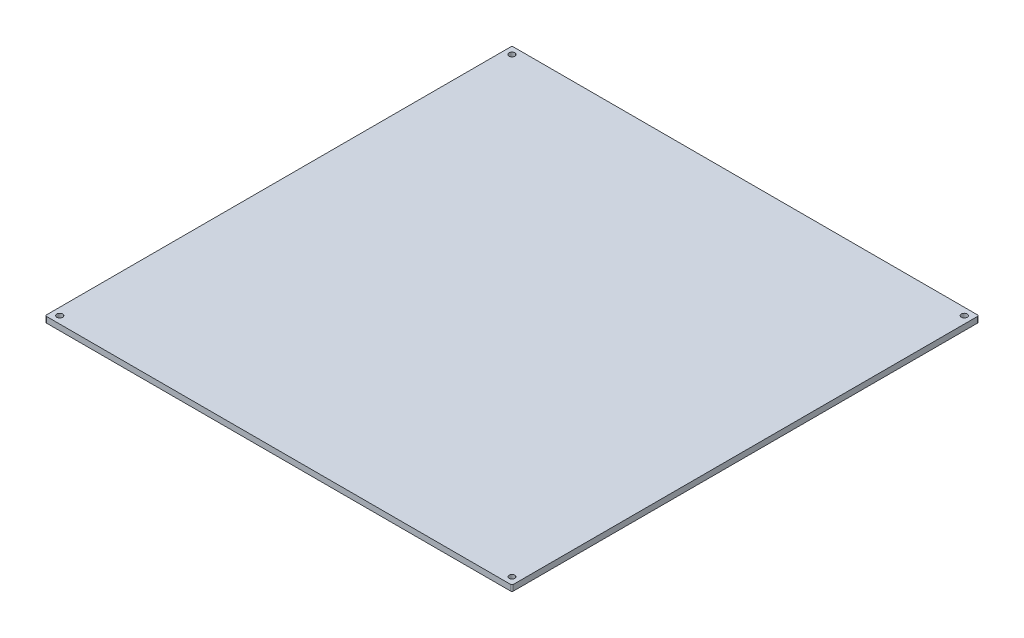
ISO-10303-21;
HEADER;
FILE_DESCRIPTION(('STEP AP214'),'2;1');
FILE_NAME('part.step','',(''),(''),'','','');
FILE_SCHEMA(('AUTOMOTIVE_DESIGN { 1 0 10303 214 1 1 1 1 }'));
ENDSEC;
DATA;
#1=APPLICATION_CONTEXT('core data for automotive mechanical design processes');
#2=APPLICATION_PROTOCOL_DEFINITION('international standard','automotive_design',2000,#1);
#3=PRODUCT_CONTEXT('',#1,'mechanical');
#4=PRODUCT('Part','Part','',(#3));
#5=PRODUCT_RELATED_PRODUCT_CATEGORY('part','',(#4));
#6=PRODUCT_DEFINITION_FORMATION('','',#4);
#7=PRODUCT_DEFINITION_CONTEXT('part definition',#1,'design');
#8=PRODUCT_DEFINITION('design','',#6,#7);
#9=PRODUCT_DEFINITION_SHAPE('','',#8);
#10=(LENGTH_UNIT() NAMED_UNIT(*) SI_UNIT(.MILLI.,.METRE.));
#11=(NAMED_UNIT(*) PLANE_ANGLE_UNIT() SI_UNIT($,.RADIAN.));
#12=(NAMED_UNIT(*) SI_UNIT($,.STERADIAN.) SOLID_ANGLE_UNIT());
#13=UNCERTAINTY_MEASURE_WITH_UNIT(LENGTH_MEASURE(1.E-05),#10,'distance_accuracy_value','');
#14=(GEOMETRIC_REPRESENTATION_CONTEXT(3) GLOBAL_UNCERTAINTY_ASSIGNED_CONTEXT((#13)) GLOBAL_UNIT_ASSIGNED_CONTEXT((#10,
#11,#12)) REPRESENTATION_CONTEXT('',''));
#15=CARTESIAN_POINT('',(0.,0.,0.));
#16=DIRECTION('',(0.,0.,1.));
#17=DIRECTION('',(1.,0.,0.));
#18=AXIS2_PLACEMENT_3D('',#15,#16,#17);
#19=CARTESIAN_POINT('',(-159.,4.,159.));
#20=DIRECTION('',(0.,-1.,0.));
#21=DIRECTION('',(0.,0.,-1.));
#22=AXIS2_PLACEMENT_3D('',#19,#20,#21);
#23=PLANE('',#22);
#24=CARTESIAN_POINT('',(-159.,4.,159.));
#25=DIRECTION('',(0.,1.,0.));
#26=DIRECTION('',(0.,0.,-1.));
#27=AXIS2_PLACEMENT_3D('',#24,#25,#26);
#28=CIRCLE('',#27,1.);
#29=CARTESIAN_POINT('',(-160.,4.,159.));
#30=VERTEX_POINT('',#29);
#31=CARTESIAN_POINT('',(-159.,4.,160.));
#32=VERTEX_POINT('',#31);
#33=EDGE_CURVE('E144',#30,#32,#28,.T.);
#34=ORIENTED_EDGE('',*,*,#33,.T.);
#35=DIRECTION('',(1.,0.,0.));
#36=VECTOR('',#35,1.);
#37=CARTESIAN_POINT('',(-159.,4.,160.));
#38=LINE('',#37,#36);
#39=CARTESIAN_POINT('',(159.,4.,160.));
#40=VERTEX_POINT('',#39);
#41=EDGE_CURVE('E92',#32,#40,#38,.T.);
#42=ORIENTED_EDGE('',*,*,#41,.T.);
#43=CARTESIAN_POINT('',(159.,4.,159.));
#44=DIRECTION('',(0.,1.,0.));
#45=DIRECTION('',(0.,0.,1.));
#46=AXIS2_PLACEMENT_3D('',#43,#44,#45);
#47=CIRCLE('',#46,1.);
#48=CARTESIAN_POINT('',(160.,4.,159.));
#49=VERTEX_POINT('',#48);
#50=EDGE_CURVE('E159',#40,#49,#47,.T.);
#51=ORIENTED_EDGE('',*,*,#50,.T.);
#52=DIRECTION('',(0.,0.,-1.));
#53=VECTOR('',#52,1.);
#54=CARTESIAN_POINT('',(160.,4.,159.));
#55=LINE('',#54,#53);
#56=CARTESIAN_POINT('',(160.,4.,-159.));
#57=VERTEX_POINT('',#56);
#58=EDGE_CURVE('E172',#49,#57,#55,.T.);
#59=ORIENTED_EDGE('',*,*,#58,.T.);
#60=CARTESIAN_POINT('',(159.,4.,-159.));
#61=DIRECTION('',(0.,1.,0.));
#62=DIRECTION('',(0.,0.,-1.));
#63=AXIS2_PLACEMENT_3D('',#60,#61,#62);
#64=CIRCLE('',#63,1.);
#65=CARTESIAN_POINT('',(159.,4.,-160.));
#66=VERTEX_POINT('',#65);
#67=EDGE_CURVE('E111',#57,#66,#64,.T.);
#68=ORIENTED_EDGE('',*,*,#67,.T.);
#69=DIRECTION('',(-1.,0.,0.));
#70=VECTOR('',#69,1.);
#71=CARTESIAN_POINT('',(-159.,4.,-160.));
#72=LINE('',#71,#70);
#73=CARTESIAN_POINT('',(-159.,4.,-160.));
#74=VERTEX_POINT('',#73);
#75=EDGE_CURVE('E105',#66,#74,#72,.T.);
#76=ORIENTED_EDGE('',*,*,#75,.T.);
#77=CARTESIAN_POINT('',(-159.,4.,-159.));
#78=DIRECTION('',(0.,1.,0.));
#79=DIRECTION('',(0.,0.,-1.));
#80=AXIS2_PLACEMENT_3D('',#77,#78,#79);
#81=CIRCLE('',#80,1.);
#82=CARTESIAN_POINT('',(-160.,4.,-159.));
#83=VERTEX_POINT('',#82);
#84=EDGE_CURVE('E109',#74,#83,#81,.T.);
#85=ORIENTED_EDGE('',*,*,#84,.T.);
#86=DIRECTION('',(0.,0.,1.));
#87=VECTOR('',#86,1.);
#88=CARTESIAN_POINT('',(-160.,4.,159.));
#89=LINE('',#88,#87);
#90=EDGE_CURVE('E49',#83,#30,#89,.T.);
#91=ORIENTED_EDGE('',*,*,#90,.T.);
#92=EDGE_LOOP('',(#34,#42,#51,#59,#68,#76,#85,#91));
#93=FACE_BOUND('',#92,.T.);
#94=CARTESIAN_POINT('',(-155.,4.,-155.));
#95=DIRECTION('',(0.,1.,0.));
#96=DIRECTION('',(0.,0.,1.));
#97=AXIS2_PLACEMENT_3D('',#94,#95,#96);
#98=CIRCLE('',#97,2.);
#99=CARTESIAN_POINT('',(-155.,4.,-153.));
#100=VERTEX_POINT('',#99);
#101=EDGE_CURVE('E133',#100,#100,#98,.T.);
#102=ORIENTED_EDGE('',*,*,#101,.F.);
#103=EDGE_LOOP('',(#102));
#104=FACE_BOUND('',#103,.T.);
#105=CARTESIAN_POINT('',(155.,4.,-155.));
#106=DIRECTION('',(0.,1.,0.));
#107=DIRECTION('',(0.,0.,1.));
#108=AXIS2_PLACEMENT_3D('',#105,#106,#107);
#109=CIRCLE('',#108,2.);
#110=CARTESIAN_POINT('',(155.,4.,-153.));
#111=VERTEX_POINT('',#110);
#112=EDGE_CURVE('E181',#111,#111,#109,.T.);
#113=ORIENTED_EDGE('',*,*,#112,.F.);
#114=EDGE_LOOP('',(#113));
#115=FACE_BOUND('',#114,.T.);
#116=CARTESIAN_POINT('',(-155.,4.,155.));
#117=DIRECTION('',(0.,1.,0.));
#118=DIRECTION('',(0.,0.,1.));
#119=AXIS2_PLACEMENT_3D('',#116,#117,#118);
#120=CIRCLE('',#119,2.);
#121=CARTESIAN_POINT('',(-155.,4.,157.));
#122=VERTEX_POINT('',#121);
#123=EDGE_CURVE('E187',#122,#122,#120,.T.);
#124=ORIENTED_EDGE('',*,*,#123,.F.);
#125=EDGE_LOOP('',(#124));
#126=FACE_BOUND('',#125,.T.);
#127=CARTESIAN_POINT('',(155.,4.,155.));
#128=DIRECTION('',(0.,1.,0.));
#129=DIRECTION('',(0.,0.,1.));
#130=AXIS2_PLACEMENT_3D('',#127,#128,#129);
#131=CIRCLE('',#130,2.);
#132=CARTESIAN_POINT('',(155.,4.,157.));
#133=VERTEX_POINT('',#132);
#134=EDGE_CURVE('E193',#133,#133,#131,.T.);
#135=ORIENTED_EDGE('',*,*,#134,.F.);
#136=EDGE_LOOP('',(#135));
#137=FACE_BOUND('',#136,.T.);
#138=ADVANCED_FACE('F32',(#93,#104,#115,#126,#137),#23,.F.);
#139=CARTESIAN_POINT('',(-159.,0.,159.));
#140=DIRECTION('',(0.,-1.,0.));
#141=DIRECTION('',(0.,0.,-1.));
#142=AXIS2_PLACEMENT_3D('',#139,#140,#141);
#143=PLANE('',#142);
#144=CARTESIAN_POINT('',(-155.,0.,155.));
#145=DIRECTION('',(0.,1.,0.));
#146=DIRECTION('',(0.,0.,1.));
#147=AXIS2_PLACEMENT_3D('',#144,#145,#146);
#148=CIRCLE('',#147,2.);
#149=CARTESIAN_POINT('',(-155.,0.,157.));
#150=VERTEX_POINT('',#149);
#151=EDGE_CURVE('E190',#150,#150,#148,.T.);
#152=ORIENTED_EDGE('',*,*,#151,.T.);
#153=EDGE_LOOP('',(#152));
#154=FACE_BOUND('',#153,.T.);
#155=CARTESIAN_POINT('',(-155.,0.,-155.));
#156=DIRECTION('',(0.,1.,0.));
#157=DIRECTION('',(0.,0.,1.));
#158=AXIS2_PLACEMENT_3D('',#155,#156,#157);
#159=CIRCLE('',#158,2.);
#160=CARTESIAN_POINT('',(-155.,0.,-153.));
#161=VERTEX_POINT('',#160);
#162=EDGE_CURVE('E178',#161,#161,#159,.T.);
#163=ORIENTED_EDGE('',*,*,#162,.T.);
#164=EDGE_LOOP('',(#163));
#165=FACE_BOUND('',#164,.T.);
#166=CARTESIAN_POINT('',(-159.,0.,159.));
#167=DIRECTION('',(0.,1.,0.));
#168=DIRECTION('',(0.,0.,-1.));
#169=AXIS2_PLACEMENT_3D('',#166,#167,#168);
#170=CIRCLE('',#169,1.);
#171=CARTESIAN_POINT('',(-160.,0.,159.));
#172=VERTEX_POINT('',#171);
#173=CARTESIAN_POINT('',(-159.,0.,160.));
#174=VERTEX_POINT('',#173);
#175=EDGE_CURVE('E129',#172,#174,#170,.T.);
#176=ORIENTED_EDGE('',*,*,#175,.F.);
#177=DIRECTION('',(0.,0.,1.));
#178=VECTOR('',#177,1.);
#179=CARTESIAN_POINT('',(-160.,0.,159.));
#180=LINE('',#179,#178);
#181=CARTESIAN_POINT('',(-160.,0.,-159.));
#182=VERTEX_POINT('',#181);
#183=EDGE_CURVE('E84',#182,#172,#180,.T.);
#184=ORIENTED_EDGE('',*,*,#183,.F.);
#185=CARTESIAN_POINT('',(-159.,0.,-159.));
#186=DIRECTION('',(0.,1.,0.));
#187=DIRECTION('',(0.,0.,-1.));
#188=AXIS2_PLACEMENT_3D('',#185,#186,#187);
#189=CIRCLE('',#188,1.);
#190=CARTESIAN_POINT('',(-159.,0.,-160.));
#191=VERTEX_POINT('',#190);
#192=EDGE_CURVE('E78',#191,#182,#189,.T.);
#193=ORIENTED_EDGE('',*,*,#192,.F.);
#194=DIRECTION('',(-1.,0.,0.));
#195=VECTOR('',#194,1.);
#196=CARTESIAN_POINT('',(-159.,0.,-160.));
#197=LINE('',#196,#195);
#198=CARTESIAN_POINT('',(159.,0.,-160.));
#199=VERTEX_POINT('',#198);
#200=EDGE_CURVE('E119',#199,#191,#197,.T.);
#201=ORIENTED_EDGE('',*,*,#200,.F.);
#202=CARTESIAN_POINT('',(159.,0.,-159.));
#203=DIRECTION('',(0.,1.,0.));
#204=DIRECTION('',(0.,0.,-1.));
#205=AXIS2_PLACEMENT_3D('',#202,#203,#204);
#206=CIRCLE('',#205,1.);
#207=CARTESIAN_POINT('',(160.,0.,-159.));
#208=VERTEX_POINT('',#207);
#209=EDGE_CURVE('E139',#208,#199,#206,.T.);
#210=ORIENTED_EDGE('',*,*,#209,.F.);
#211=DIRECTION('',(0.,0.,-1.));
#212=VECTOR('',#211,1.);
#213=CARTESIAN_POINT('',(160.,0.,159.));
#214=LINE('',#213,#212);
#215=CARTESIAN_POINT('',(160.,0.,159.));
#216=VERTEX_POINT('',#215);
#217=EDGE_CURVE('E137',#216,#208,#214,.T.);
#218=ORIENTED_EDGE('',*,*,#217,.F.);
#219=CARTESIAN_POINT('',(159.,0.,159.));
#220=DIRECTION('',(0.,1.,0.));
#221=DIRECTION('',(0.,0.,1.));
#222=AXIS2_PLACEMENT_3D('',#219,#220,#221);
#223=CIRCLE('',#222,1.);
#224=CARTESIAN_POINT('',(159.,0.,160.));
#225=VERTEX_POINT('',#224);
#226=EDGE_CURVE('E135',#225,#216,#223,.T.);
#227=ORIENTED_EDGE('',*,*,#226,.F.);
#228=DIRECTION('',(1.,0.,0.));
#229=VECTOR('',#228,1.);
#230=CARTESIAN_POINT('',(-159.,0.,160.));
#231=LINE('',#230,#229);
#232=EDGE_CURVE('E132',#174,#225,#231,.T.);
#233=ORIENTED_EDGE('',*,*,#232,.F.);
#234=EDGE_LOOP('',(#176,#184,#193,#201,#210,#218,#227,#233));
#235=FACE_BOUND('',#234,.T.);
#236=CARTESIAN_POINT('',(155.,0.,-155.));
#237=DIRECTION('',(0.,1.,0.));
#238=DIRECTION('',(0.,0.,1.));
#239=AXIS2_PLACEMENT_3D('',#236,#237,#238);
#240=CIRCLE('',#239,2.);
#241=CARTESIAN_POINT('',(155.,0.,-153.));
#242=VERTEX_POINT('',#241);
#243=EDGE_CURVE('E184',#242,#242,#240,.T.);
#244=ORIENTED_EDGE('',*,*,#243,.T.);
#245=EDGE_LOOP('',(#244));
#246=FACE_BOUND('',#245,.T.);
#247=CARTESIAN_POINT('',(155.,0.,155.));
#248=DIRECTION('',(0.,1.,0.));
#249=DIRECTION('',(0.,0.,1.));
#250=AXIS2_PLACEMENT_3D('',#247,#248,#249);
#251=CIRCLE('',#250,2.);
#252=CARTESIAN_POINT('',(155.,0.,157.));
#253=VERTEX_POINT('',#252);
#254=EDGE_CURVE('E196',#253,#253,#251,.T.);
#255=ORIENTED_EDGE('',*,*,#254,.T.);
#256=EDGE_LOOP('',(#255));
#257=FACE_BOUND('',#256,.T.);
#258=ADVANCED_FACE('F163',(#154,#165,#235,#246,#257),#143,.T.);
#259=CARTESIAN_POINT('',(-159.,4.,159.));
#260=DIRECTION('',(0.,-1.,0.));
#261=DIRECTION('',(0.,0.,-1.));
#262=AXIS2_PLACEMENT_3D('',#259,#260,#261);
#263=CYLINDRICAL_SURFACE('',#262,1.);
#264=ORIENTED_EDGE('',*,*,#175,.T.);
#265=DIRECTION('',(0.,-1.,0.));
#266=VECTOR('',#265,1.);
#267=CARTESIAN_POINT('',(-159.,4.,160.));
#268=LINE('',#267,#266);
#269=EDGE_CURVE('E11',#32,#174,#268,.T.);
#270=ORIENTED_EDGE('',*,*,#269,.F.);
#271=ORIENTED_EDGE('',*,*,#33,.F.);
#272=DIRECTION('',(0.,-1.,0.));
#273=VECTOR('',#272,1.);
#274=CARTESIAN_POINT('',(-160.,4.,159.));
#275=LINE('',#274,#273);
#276=EDGE_CURVE('E125',#30,#172,#275,.T.);
#277=ORIENTED_EDGE('',*,*,#276,.T.);
#278=EDGE_LOOP('',(#264,#270,#271,#277));
#279=FACE_BOUND('',#278,.T.);
#280=ADVANCED_FACE('F34',(#279),#263,.T.);
#281=CARTESIAN_POINT('',(-159.,4.,160.));
#282=DIRECTION('',(0.,0.,-1.));
#283=DIRECTION('',(-1.,0.,0.));
#284=AXIS2_PLACEMENT_3D('',#281,#282,#283);
#285=PLANE('',#284);
#286=ORIENTED_EDGE('',*,*,#232,.T.);
#287=DIRECTION('',(0.,-1.,0.));
#288=VECTOR('',#287,1.);
#289=CARTESIAN_POINT('',(159.,4.,160.));
#290=LINE('',#289,#288);
#291=EDGE_CURVE('E41',#40,#225,#290,.T.);
#292=ORIENTED_EDGE('',*,*,#291,.F.);
#293=ORIENTED_EDGE('',*,*,#41,.F.);
#294=ORIENTED_EDGE('',*,*,#269,.T.);
#295=EDGE_LOOP('',(#286,#292,#293,#294));
#296=FACE_BOUND('',#295,.T.);
#297=ADVANCED_FACE('F228',(#296),#285,.F.);
#298=CARTESIAN_POINT('',(159.,4.,159.));
#299=DIRECTION('',(0.,-1.,0.));
#300=DIRECTION('',(0.,0.,-1.));
#301=AXIS2_PLACEMENT_3D('',#298,#299,#300);
#302=CYLINDRICAL_SURFACE('',#301,1.);
#303=ORIENTED_EDGE('',*,*,#226,.T.);
#304=DIRECTION('',(0.,-1.,0.));
#305=VECTOR('',#304,1.);
#306=CARTESIAN_POINT('',(160.,4.,159.));
#307=LINE('',#306,#305);
#308=EDGE_CURVE('E151',#49,#216,#307,.T.);
#309=ORIENTED_EDGE('',*,*,#308,.F.);
#310=ORIENTED_EDGE('',*,*,#50,.F.);
#311=ORIENTED_EDGE('',*,*,#291,.T.);
#312=EDGE_LOOP('',(#303,#309,#310,#311));
#313=FACE_BOUND('',#312,.T.);
#314=ADVANCED_FACE('F157',(#313),#302,.T.);
#315=CARTESIAN_POINT('',(160.,4.,159.));
#316=DIRECTION('',(-1.,0.,0.));
#317=DIRECTION('',(0.,0.,1.));
#318=AXIS2_PLACEMENT_3D('',#315,#316,#317);
#319=PLANE('',#318);
#320=ORIENTED_EDGE('',*,*,#217,.T.);
#321=DIRECTION('',(0.,-1.,0.));
#322=VECTOR('',#321,1.);
#323=CARTESIAN_POINT('',(160.,4.,-159.));
#324=LINE('',#323,#322);
#325=EDGE_CURVE('E148',#57,#208,#324,.T.);
#326=ORIENTED_EDGE('',*,*,#325,.F.);
#327=ORIENTED_EDGE('',*,*,#58,.F.);
#328=ORIENTED_EDGE('',*,*,#308,.T.);
#329=EDGE_LOOP('',(#320,#326,#327,#328));
#330=FACE_BOUND('',#329,.T.);
#331=ADVANCED_FACE('F168',(#330),#319,.F.);
#332=CARTESIAN_POINT('',(159.,4.,-159.));
#333=DIRECTION('',(0.,-1.,0.));
#334=DIRECTION('',(0.,0.,-1.));
#335=AXIS2_PLACEMENT_3D('',#332,#333,#334);
#336=CYLINDRICAL_SURFACE('',#335,1.);
#337=ORIENTED_EDGE('',*,*,#209,.T.);
#338=DIRECTION('',(0.,-1.,0.));
#339=VECTOR('',#338,1.);
#340=CARTESIAN_POINT('',(159.,4.,-160.));
#341=LINE('',#340,#339);
#342=EDGE_CURVE('E120',#66,#199,#341,.T.);
#343=ORIENTED_EDGE('',*,*,#342,.F.);
#344=ORIENTED_EDGE('',*,*,#67,.F.);
#345=ORIENTED_EDGE('',*,*,#325,.T.);
#346=EDGE_LOOP('',(#337,#343,#344,#345));
#347=FACE_BOUND('',#346,.T.);
#348=ADVANCED_FACE('F171',(#347),#336,.T.);
#349=CARTESIAN_POINT('',(-159.,4.,-160.));
#350=DIRECTION('',(0.,0.,1.));
#351=DIRECTION('',(1.,0.,0.));
#352=AXIS2_PLACEMENT_3D('',#349,#350,#351);
#353=PLANE('',#352);
#354=ORIENTED_EDGE('',*,*,#200,.T.);
#355=DIRECTION('',(0.,-1.,0.));
#356=VECTOR('',#355,1.);
#357=CARTESIAN_POINT('',(-159.,4.,-160.));
#358=LINE('',#357,#356);
#359=EDGE_CURVE('E116',#74,#191,#358,.T.);
#360=ORIENTED_EDGE('',*,*,#359,.F.);
#361=ORIENTED_EDGE('',*,*,#75,.F.);
#362=ORIENTED_EDGE('',*,*,#342,.T.);
#363=EDGE_LOOP('',(#354,#360,#361,#362));
#364=FACE_BOUND('',#363,.T.);
#365=ADVANCED_FACE('F117',(#364),#353,.F.);
#366=CARTESIAN_POINT('',(-159.,4.,-159.));
#367=DIRECTION('',(0.,-1.,0.));
#368=DIRECTION('',(0.,0.,-1.));
#369=AXIS2_PLACEMENT_3D('',#366,#367,#368);
#370=CYLINDRICAL_SURFACE('',#369,1.);
#371=ORIENTED_EDGE('',*,*,#192,.T.);
#372=DIRECTION('',(0.,-1.,0.));
#373=VECTOR('',#372,1.);
#374=CARTESIAN_POINT('',(-160.,4.,-159.));
#375=LINE('',#374,#373);
#376=EDGE_CURVE('E121',#83,#182,#375,.T.);
#377=ORIENTED_EDGE('',*,*,#376,.F.);
#378=ORIENTED_EDGE('',*,*,#84,.F.);
#379=ORIENTED_EDGE('',*,*,#359,.T.);
#380=EDGE_LOOP('',(#371,#377,#378,#379));
#381=FACE_BOUND('',#380,.T.);
#382=ADVANCED_FACE('F123',(#381),#370,.T.);
#383=CARTESIAN_POINT('',(-160.,4.,159.));
#384=DIRECTION('',(1.,0.,0.));
#385=DIRECTION('',(0.,0.,-1.));
#386=AXIS2_PLACEMENT_3D('',#383,#384,#385);
#387=PLANE('',#386);
#388=ORIENTED_EDGE('',*,*,#183,.T.);
#389=ORIENTED_EDGE('',*,*,#276,.F.);
#390=ORIENTED_EDGE('',*,*,#90,.F.);
#391=ORIENTED_EDGE('',*,*,#376,.T.);
#392=EDGE_LOOP('',(#388,#389,#390,#391));
#393=FACE_BOUND('',#392,.T.);
#394=ADVANCED_FACE('F216',(#393),#387,.F.);
#395=CARTESIAN_POINT('',(-155.,4.,-155.));
#396=DIRECTION('',(0.,-1.,0.));
#397=DIRECTION('',(0.,0.,-1.));
#398=AXIS2_PLACEMENT_3D('',#395,#396,#397);
#399=CYLINDRICAL_SURFACE('',#398,2.);
#400=ORIENTED_EDGE('',*,*,#101,.T.);
#401=EDGE_LOOP('',(#400));
#402=FACE_BOUND('',#401,.T.);
#403=ORIENTED_EDGE('',*,*,#162,.F.);
#404=EDGE_LOOP('',(#403));
#405=FACE_BOUND('',#404,.T.);
#406=ADVANCED_FACE('F213',(#402,#405),#399,.F.);
#407=CARTESIAN_POINT('',(155.,4.,-155.));
#408=DIRECTION('',(0.,-1.,0.));
#409=DIRECTION('',(0.,0.,-1.));
#410=AXIS2_PLACEMENT_3D('',#407,#408,#409);
#411=CYLINDRICAL_SURFACE('',#410,2.);
#412=ORIENTED_EDGE('',*,*,#112,.T.);
#413=EDGE_LOOP('',(#412));
#414=FACE_BOUND('',#413,.T.);
#415=ORIENTED_EDGE('',*,*,#243,.F.);
#416=EDGE_LOOP('',(#415));
#417=FACE_BOUND('',#416,.T.);
#418=ADVANCED_FACE('F292',(#414,#417),#411,.F.);
#419=CARTESIAN_POINT('',(-155.,4.,155.));
#420=DIRECTION('',(0.,-1.,0.));
#421=DIRECTION('',(0.,0.,-1.));
#422=AXIS2_PLACEMENT_3D('',#419,#420,#421);
#423=CYLINDRICAL_SURFACE('',#422,2.);
#424=ORIENTED_EDGE('',*,*,#123,.T.);
#425=EDGE_LOOP('',(#424));
#426=FACE_BOUND('',#425,.T.);
#427=ORIENTED_EDGE('',*,*,#151,.F.);
#428=EDGE_LOOP('',(#427));
#429=FACE_BOUND('',#428,.T.);
#430=ADVANCED_FACE('F300',(#426,#429),#423,.F.);
#431=CARTESIAN_POINT('',(155.,4.,155.));
#432=DIRECTION('',(0.,-1.,0.));
#433=DIRECTION('',(0.,0.,-1.));
#434=AXIS2_PLACEMENT_3D('',#431,#432,#433);
#435=CYLINDRICAL_SURFACE('',#434,2.);
#436=ORIENTED_EDGE('',*,*,#134,.T.);
#437=EDGE_LOOP('',(#436));
#438=FACE_BOUND('',#437,.T.);
#439=ORIENTED_EDGE('',*,*,#254,.F.);
#440=EDGE_LOOP('',(#439));
#441=FACE_BOUND('',#440,.T.);
#442=ADVANCED_FACE('F202',(#438,#441),#435,.F.);
#443=CLOSED_SHELL('',(#138,#258,#280,#297,#314,#331,#348,#365,#382,#394,#406,#418,#430,#442));
#444=MANIFOLD_SOLID_BREP('B2',#443);
#445=ADVANCED_BREP_SHAPE_REPRESENTATION('',(#18,#444),#14);
#446=SHAPE_DEFINITION_REPRESENTATION(#9,#445);
ENDSEC;
END-ISO-10303-21;
